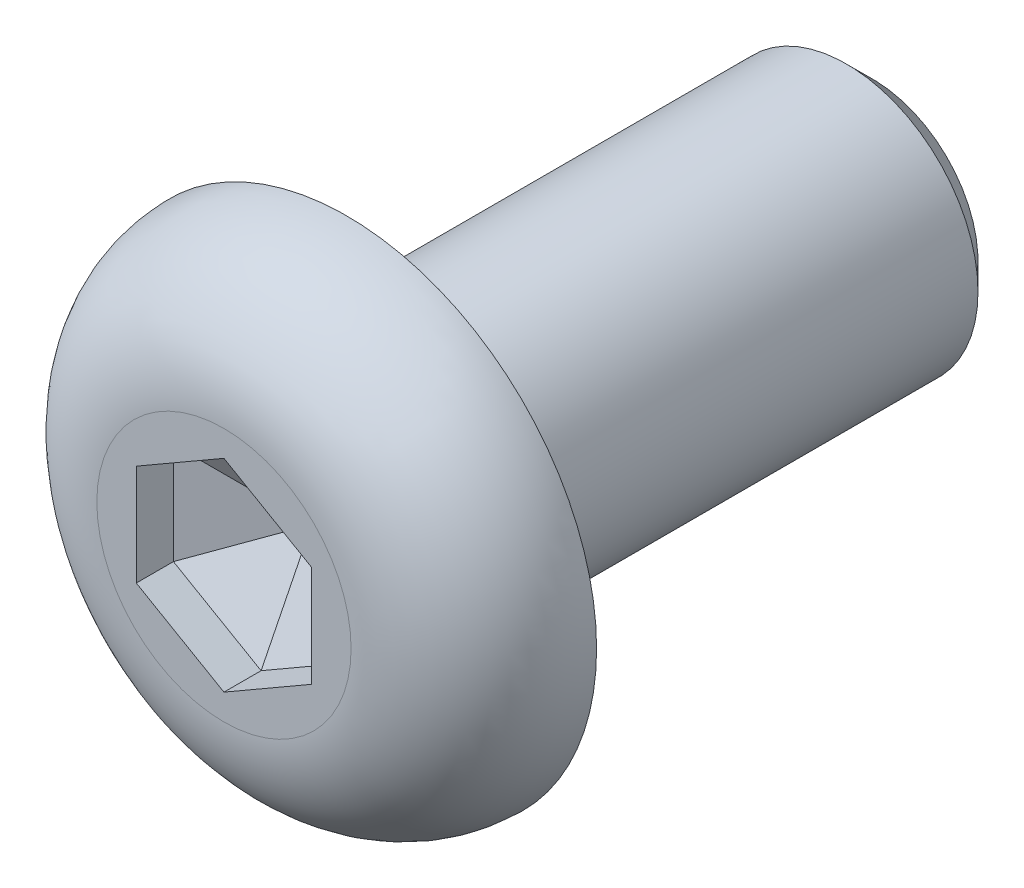
ISO-10303-21;
HEADER;
FILE_DESCRIPTION(('STEP AP214'),'2;1');
FILE_NAME('part.step','',(''),(''),'','','');
FILE_SCHEMA(('AUTOMOTIVE_DESIGN { 1 0 10303 214 1 1 1 1 }'));
ENDSEC;
DATA;
#1=APPLICATION_CONTEXT('core data for automotive mechanical design processes');
#2=APPLICATION_PROTOCOL_DEFINITION('international standard','automotive_design',2000,#1);
#3=PRODUCT_CONTEXT('',#1,'mechanical');
#4=PRODUCT('Part','Part','',(#3));
#5=PRODUCT_RELATED_PRODUCT_CATEGORY('part','',(#4));
#6=PRODUCT_DEFINITION_FORMATION('','',#4);
#7=PRODUCT_DEFINITION_CONTEXT('part definition',#1,'design');
#8=PRODUCT_DEFINITION('design','',#6,#7);
#9=PRODUCT_DEFINITION_SHAPE('','',#8);
#10=(LENGTH_UNIT() NAMED_UNIT(*) SI_UNIT(.MILLI.,.METRE.));
#11=(NAMED_UNIT(*) PLANE_ANGLE_UNIT() SI_UNIT($,.RADIAN.));
#12=(NAMED_UNIT(*) SI_UNIT($,.STERADIAN.) SOLID_ANGLE_UNIT());
#13=UNCERTAINTY_MEASURE_WITH_UNIT(LENGTH_MEASURE(1.E-05),#10,'distance_accuracy_value','');
#14=(GEOMETRIC_REPRESENTATION_CONTEXT(3) GLOBAL_UNCERTAINTY_ASSIGNED_CONTEXT((#13)) GLOBAL_UNIT_ASSIGNED_CONTEXT((#10,
#11,#12)) REPRESENTATION_CONTEXT('',''));
#15=CARTESIAN_POINT('',(0.,0.,0.));
#16=DIRECTION('',(0.,0.,1.));
#17=DIRECTION('',(1.,0.,0.));
#18=AXIS2_PLACEMENT_3D('',#15,#16,#17);
#19=CARTESIAN_POINT('',(0.,0.,0.));
#20=DIRECTION('',(0.,0.,1.));
#21=DIRECTION('',(1.,0.,0.));
#22=AXIS2_PLACEMENT_3D('',#19,#20,#21);
#23=PLANE('',#22);
#24=CARTESIAN_POINT('',(0.,0.,0.));
#25=DIRECTION('',(0.,0.,1.));
#26=DIRECTION('',(1.,0.,0.));
#27=AXIS2_PLACEMENT_3D('',#24,#25,#26);
#28=CIRCLE('',#27,1.6);
#29=CARTESIAN_POINT('',(1.6,0.,0.));
#30=VERTEX_POINT('',#29);
#31=EDGE_CURVE('E11',#30,#30,#28,.T.);
#32=ORIENTED_EDGE('',*,*,#31,.T.);
#33=EDGE_LOOP('',(#32));
#34=FACE_BOUND('',#33,.T.);
#35=CARTESIAN_POINT('',(0.,0.,0.));
#36=DIRECTION('',(0.,0.,1.));
#37=DIRECTION('',(1.,0.,0.));
#38=AXIS2_PLACEMENT_3D('',#35,#36,#37);
#39=CIRCLE('',#38,2.85);
#40=CARTESIAN_POINT('',(2.85,0.,0.));
#41=VERTEX_POINT('',#40);
#42=EDGE_CURVE('E150',#41,#41,#39,.T.);
#43=ORIENTED_EDGE('',*,*,#42,.F.);
#44=EDGE_LOOP('',(#43));
#45=FACE_BOUND('',#44,.T.);
#46=ADVANCED_FACE('F42',(#34,#45),#23,.F.);
#47=CARTESIAN_POINT('',(0.,0.,1.4));
#48=DIRECTION('',(0.,0.,1.));
#49=DIRECTION('',(1.,0.,0.));
#50=AXIS2_PLACEMENT_3D('',#47,#48,#49);
#51=PLANE('',#50);
#52=DIRECTION('',(0.,1.,0.));
#53=VECTOR('',#52,1.);
#54=CARTESIAN_POINT('',(1.,-0.577350269189626,1.4));
#55=LINE('',#54,#53);
#56=CARTESIAN_POINT('',(1.,-0.577350269189626,1.4));
#57=VERTEX_POINT('',#56);
#58=CARTESIAN_POINT('',(1.,0.577350269189626,1.4));
#59=VERTEX_POINT('',#58);
#60=EDGE_CURVE('E131',#57,#59,#55,.T.);
#61=ORIENTED_EDGE('',*,*,#60,.F.);
#62=DIRECTION('',(0.866025403784439,0.5,0.));
#63=VECTOR('',#62,1.);
#64=CARTESIAN_POINT('',(0.,-1.15470053837925,1.4));
#65=LINE('',#64,#63);
#66=CARTESIAN_POINT('',(0.,-1.15470053837925,1.4));
#67=VERTEX_POINT('',#66);
#68=EDGE_CURVE('E145',#67,#57,#65,.T.);
#69=ORIENTED_EDGE('',*,*,#68,.F.);
#70=DIRECTION('',(0.866025403784439,-0.5,0.));
#71=VECTOR('',#70,1.);
#72=CARTESIAN_POINT('',(-1.,-0.577350269189626,1.4));
#73=LINE('',#72,#71);
#74=CARTESIAN_POINT('',(-1.,-0.577350269189626,1.4));
#75=VERTEX_POINT('',#74);
#76=EDGE_CURVE('E139',#75,#67,#73,.T.);
#77=ORIENTED_EDGE('',*,*,#76,.F.);
#78=DIRECTION('',(0.,-1.,0.));
#79=VECTOR('',#78,1.);
#80=CARTESIAN_POINT('',(-1.,0.577350269189626,1.4));
#81=LINE('',#80,#79);
#82=CARTESIAN_POINT('',(-1.,0.577350269189626,1.4));
#83=VERTEX_POINT('',#82);
#84=EDGE_CURVE('E137',#83,#75,#81,.T.);
#85=ORIENTED_EDGE('',*,*,#84,.F.);
#86=DIRECTION('',(-0.866025403784439,-0.5,0.));
#87=VECTOR('',#86,1.);
#88=CARTESIAN_POINT('',(0.,1.15470053837925,1.4));
#89=LINE('',#88,#87);
#90=CARTESIAN_POINT('',(0.,1.15470053837925,1.4));
#91=VERTEX_POINT('',#90);
#92=EDGE_CURVE('E118',#91,#83,#89,.T.);
#93=ORIENTED_EDGE('',*,*,#92,.F.);
#94=DIRECTION('',(-0.866025403784439,0.5,0.));
#95=VECTOR('',#94,1.);
#96=CARTESIAN_POINT('',(1.,0.577350269189626,1.4));
#97=LINE('',#96,#95);
#98=EDGE_CURVE('E126',#59,#91,#97,.T.);
#99=ORIENTED_EDGE('',*,*,#98,.F.);
#100=EDGE_LOOP('',(#61,#69,#77,#85,#93,#99));
#101=FACE_BOUND('',#100,.T.);
#102=CARTESIAN_POINT('',(0.,0.,1.4));
#103=DIRECTION('',(0.,0.,1.));
#104=DIRECTION('',(1.,0.,0.));
#105=AXIS2_PLACEMENT_3D('',#102,#103,#104);
#106=CIRCLE('',#105,1.45);
#107=CARTESIAN_POINT('',(1.45,0.,1.4));
#108=VERTEX_POINT('',#107);
#109=EDGE_CURVE('E159',#108,#108,#106,.T.);
#110=ORIENTED_EDGE('',*,*,#109,.T.);
#111=EDGE_LOOP('',(#110));
#112=FACE_BOUND('',#111,.T.);
#113=ADVANCED_FACE('F133',(#101,#112),#51,.T.);
#114=CARTESIAN_POINT('',(0.,0.,0.));
#115=DIRECTION('',(0.,0.,1.));
#116=DIRECTION('',(1.,0.,0.));
#117=AXIS2_PLACEMENT_3D('',#114,#115,#116);
#118=TOROIDAL_SURFACE('',#117,1.45,1.4);
#119=ORIENTED_EDGE('',*,*,#42,.T.);
#120=EDGE_LOOP('',(#119));
#121=FACE_BOUND('',#120,.T.);
#122=ORIENTED_EDGE('',*,*,#109,.F.);
#123=EDGE_LOOP('',(#122));
#124=FACE_BOUND('',#123,.T.);
#125=ADVANCED_FACE('F228',(#121,#124),#118,.T.);
#126=CARTESIAN_POINT('',(0.,0.,-6.));
#127=DIRECTION('',(0.,0.,1.));
#128=DIRECTION('',(1.,0.,0.));
#129=AXIS2_PLACEMENT_3D('',#126,#127,#128);
#130=CYLINDRICAL_SURFACE('',#129,1.5);
#131=CARTESIAN_POINT('',(0.,0.,-0.1));
#132=DIRECTION('',(0.,0.,1.));
#133=DIRECTION('',(1.,0.,0.));
#134=AXIS2_PLACEMENT_3D('',#131,#132,#133);
#135=CIRCLE('',#134,1.5);
#136=CARTESIAN_POINT('',(1.5,0.,-0.1));
#137=VERTEX_POINT('',#136);
#138=EDGE_CURVE('E50',#137,#137,#135,.F.);
#139=ORIENTED_EDGE('',*,*,#138,.T.);
#140=EDGE_LOOP('',(#139));
#141=FACE_BOUND('',#140,.T.);
#142=CARTESIAN_POINT('',(0.,0.,-5.7));
#143=DIRECTION('',(0.,0.,-1.));
#144=DIRECTION('',(-1.,0.,0.));
#145=AXIS2_PLACEMENT_3D('',#142,#143,#144);
#146=CIRCLE('',#145,1.5);
#147=CARTESIAN_POINT('',(-1.5,0.,-5.7));
#148=VERTEX_POINT('',#147);
#149=EDGE_CURVE('E165',#148,#148,#146,.F.);
#150=ORIENTED_EDGE('',*,*,#149,.T.);
#151=EDGE_LOOP('',(#150));
#152=FACE_BOUND('',#151,.T.);
#153=ADVANCED_FACE('F209',(#141,#152),#130,.T.);
#154=CARTESIAN_POINT('',(0.,0.,-6.));
#155=DIRECTION('',(0.,0.,-1.));
#156=DIRECTION('',(-1.,0.,0.));
#157=AXIS2_PLACEMENT_3D('',#154,#155,#156);
#158=PLANE('',#157);
#159=CARTESIAN_POINT('',(0.,0.,-6.));
#160=DIRECTION('',(0.,0.,-1.));
#161=DIRECTION('',(-1.,0.,0.));
#162=AXIS2_PLACEMENT_3D('',#159,#160,#161);
#163=CIRCLE('',#162,1.2);
#164=CARTESIAN_POINT('',(-1.2,0.,-6.));
#165=VERTEX_POINT('',#164);
#166=EDGE_CURVE('E162',#165,#165,#163,.T.);
#167=ORIENTED_EDGE('',*,*,#166,.T.);
#168=EDGE_LOOP('',(#167));
#169=FACE_BOUND('',#168,.T.);
#170=ADVANCED_FACE('F303',(#169),#158,.T.);
#171=CARTESIAN_POINT('',(1.,-0.577350269189626,0.4));
#172=DIRECTION('',(1.,0.,0.));
#173=DIRECTION('',(0.,0.,-1.));
#174=AXIS2_PLACEMENT_3D('',#171,#172,#173);
#175=PLANE('',#174);
#176=DIRECTION('',(0.,0.,1.));
#177=VECTOR('',#176,1.);
#178=CARTESIAN_POINT('',(1.,0.577350269189626,0.4));
#179=LINE('',#178,#177);
#180=CARTESIAN_POINT('',(1.,0.577350269189626,0.97636887608069));
#181=VERTEX_POINT('',#180);
#182=EDGE_CURVE('E123',#181,#59,#179,.T.);
#183=ORIENTED_EDGE('',*,*,#182,.F.);
#184=DIRECTION('',(0.,-1.,0.));
#185=VECTOR('',#184,1.);
#186=CARTESIAN_POINT('',(1.,-0.577350269189626,0.97636887608069));
#187=LINE('',#186,#185);
#188=CARTESIAN_POINT('',(1.,-0.577350269189626,0.97636887608069));
#189=VERTEX_POINT('',#188);
#190=EDGE_CURVE('E57',#181,#189,#187,.T.);
#191=ORIENTED_EDGE('',*,*,#190,.T.);
#192=DIRECTION('',(0.,0.,1.));
#193=VECTOR('',#192,1.);
#194=CARTESIAN_POINT('',(1.,-0.577350269189626,0.4));
#195=LINE('',#194,#193);
#196=EDGE_CURVE('E148',#189,#57,#195,.T.);
#197=ORIENTED_EDGE('',*,*,#196,.T.);
#198=ORIENTED_EDGE('',*,*,#60,.T.);
#199=EDGE_LOOP('',(#183,#191,#197,#198));
#200=FACE_BOUND('',#199,.T.);
#201=ADVANCED_FACE('F294',(#200),#175,.F.);
#202=CARTESIAN_POINT('',(0.,-1.15470053837925,0.4));
#203=DIRECTION('',(0.5,-0.866025403784439,0.));
#204=DIRECTION('',(0.866025403784439,0.5,0.));
#205=AXIS2_PLACEMENT_3D('',#202,#203,#204);
#206=PLANE('',#205);
#207=ORIENTED_EDGE('',*,*,#196,.F.);
#208=DIRECTION('',(-0.866025403784439,-0.5,0.));
#209=VECTOR('',#208,1.);
#210=CARTESIAN_POINT('',(0.,-1.15470053837925,0.976368876080689));
#211=LINE('',#210,#209);
#212=CARTESIAN_POINT('',(0.,-1.15470053837925,0.976368876080689));
#213=VERTEX_POINT('',#212);
#214=EDGE_CURVE('E188',#189,#213,#211,.T.);
#215=ORIENTED_EDGE('',*,*,#214,.T.);
#216=DIRECTION('',(0.,0.,1.));
#217=VECTOR('',#216,1.);
#218=CARTESIAN_POINT('',(0.,-1.15470053837925,0.4));
#219=LINE('',#218,#217);
#220=EDGE_CURVE('E151',#213,#67,#219,.T.);
#221=ORIENTED_EDGE('',*,*,#220,.T.);
#222=ORIENTED_EDGE('',*,*,#68,.T.);
#223=EDGE_LOOP('',(#207,#215,#221,#222));
#224=FACE_BOUND('',#223,.T.);
#225=ADVANCED_FACE('F270',(#224),#206,.F.);
#226=CARTESIAN_POINT('',(-1.,-0.577350269189626,0.4));
#227=DIRECTION('',(-0.5,-0.866025403784438,0.));
#228=DIRECTION('',(0.866025403784439,-0.5,0.));
#229=AXIS2_PLACEMENT_3D('',#226,#227,#228);
#230=PLANE('',#229);
#231=ORIENTED_EDGE('',*,*,#220,.F.);
#232=DIRECTION('',(-0.866025403784439,0.5,0.));
#233=VECTOR('',#232,1.);
#234=CARTESIAN_POINT('',(-1.,-0.577350269189626,0.97636887608069));
#235=LINE('',#234,#233);
#236=CARTESIAN_POINT('',(-1.,-0.577350269189626,0.97636887608069));
#237=VERTEX_POINT('',#236);
#238=EDGE_CURVE('E181',#213,#237,#235,.T.);
#239=ORIENTED_EDGE('',*,*,#238,.T.);
#240=DIRECTION('',(0.,0.,1.));
#241=VECTOR('',#240,1.);
#242=CARTESIAN_POINT('',(-1.,-0.577350269189626,0.4));
#243=LINE('',#242,#241);
#244=EDGE_CURVE('E153',#237,#75,#243,.T.);
#245=ORIENTED_EDGE('',*,*,#244,.T.);
#246=ORIENTED_EDGE('',*,*,#76,.T.);
#247=EDGE_LOOP('',(#231,#239,#245,#246));
#248=FACE_BOUND('',#247,.T.);
#249=ADVANCED_FACE('F273',(#248),#230,.F.);
#250=CARTESIAN_POINT('',(-1.,0.577350269189626,0.4));
#251=DIRECTION('',(-1.,0.,0.));
#252=DIRECTION('',(0.,0.,1.));
#253=AXIS2_PLACEMENT_3D('',#250,#251,#252);
#254=PLANE('',#253);
#255=ORIENTED_EDGE('',*,*,#244,.F.);
#256=DIRECTION('',(0.,1.,0.));
#257=VECTOR('',#256,1.);
#258=CARTESIAN_POINT('',(-1.,0.577350269189626,0.97636887608069));
#259=LINE('',#258,#257);
#260=CARTESIAN_POINT('',(-1.,0.577350269189626,0.976368876080689));
#261=VERTEX_POINT('',#260);
#262=EDGE_CURVE('E184',#237,#261,#259,.T.);
#263=ORIENTED_EDGE('',*,*,#262,.T.);
#264=DIRECTION('',(0.,0.,1.));
#265=VECTOR('',#264,1.);
#266=CARTESIAN_POINT('',(-1.,0.577350269189626,0.4));
#267=LINE('',#266,#265);
#268=EDGE_CURVE('E122',#261,#83,#267,.T.);
#269=ORIENTED_EDGE('',*,*,#268,.T.);
#270=ORIENTED_EDGE('',*,*,#84,.T.);
#271=EDGE_LOOP('',(#255,#263,#269,#270));
#272=FACE_BOUND('',#271,.T.);
#273=ADVANCED_FACE('F282',(#272),#254,.F.);
#274=CARTESIAN_POINT('',(0.,1.15470053837925,0.4));
#275=DIRECTION('',(-0.5,0.866025403784439,0.));
#276=DIRECTION('',(-0.866025403784439,-0.5,0.));
#277=AXIS2_PLACEMENT_3D('',#274,#275,#276);
#278=PLANE('',#277);
#279=ORIENTED_EDGE('',*,*,#268,.F.);
#280=DIRECTION('',(0.866025403784439,0.5,0.));
#281=VECTOR('',#280,1.);
#282=CARTESIAN_POINT('',(0.,1.15470053837925,0.976368876080689));
#283=LINE('',#282,#281);
#284=CARTESIAN_POINT('',(0.,1.15470053837925,0.97636887608069));
#285=VERTEX_POINT('',#284);
#286=EDGE_CURVE('E121',#261,#285,#283,.T.);
#287=ORIENTED_EDGE('',*,*,#286,.T.);
#288=DIRECTION('',(0.,0.,1.));
#289=VECTOR('',#288,1.);
#290=CARTESIAN_POINT('',(0.,1.15470053837925,0.4));
#291=LINE('',#290,#289);
#292=EDGE_CURVE('E113',#285,#91,#291,.T.);
#293=ORIENTED_EDGE('',*,*,#292,.T.);
#294=ORIENTED_EDGE('',*,*,#92,.T.);
#295=EDGE_LOOP('',(#279,#287,#293,#294));
#296=FACE_BOUND('',#295,.T.);
#297=ADVANCED_FACE('F116',(#296),#278,.F.);
#298=CARTESIAN_POINT('',(1.,0.577350269189626,0.4));
#299=DIRECTION('',(0.5,0.866025403784439,0.));
#300=DIRECTION('',(-0.866025403784439,0.5,0.));
#301=AXIS2_PLACEMENT_3D('',#298,#299,#300);
#302=PLANE('',#301);
#303=ORIENTED_EDGE('',*,*,#292,.F.);
#304=DIRECTION('',(0.866025403784439,-0.5,0.));
#305=VECTOR('',#304,1.);
#306=CARTESIAN_POINT('',(1.,0.577350269189626,0.97636887608069));
#307=LINE('',#306,#305);
#308=EDGE_CURVE('E65',#285,#181,#307,.T.);
#309=ORIENTED_EDGE('',*,*,#308,.T.);
#310=ORIENTED_EDGE('',*,*,#182,.T.);
#311=ORIENTED_EDGE('',*,*,#98,.T.);
#312=EDGE_LOOP('',(#303,#309,#310,#311));
#313=FACE_BOUND('',#312,.T.);
#314=ADVANCED_FACE('F127',(#313),#302,.F.);
#315=CARTESIAN_POINT('',(0.,0.,0.4));
#316=DIRECTION('',(0.,0.,1.));
#317=DIRECTION('',(1.,0.,0.));
#318=AXIS2_PLACEMENT_3D('',#315,#316,#317);
#319=PLANE('',#318);
#320=DIRECTION('',(0.,-1.,0.));
#321=VECTOR('',#320,1.);
#322=CARTESIAN_POINT('',(-0.00169982272686209,0.,0.4));
#323=LINE('',#322,#321);
#324=CARTESIAN_POINT('',(-0.00169982272686209,0.000981393108929282,0.4));
#325=VERTEX_POINT('',#324);
#326=CARTESIAN_POINT('',(-0.00169982272686209,-0.000981393108928711,0.4));
#327=VERTEX_POINT('',#326);
#328=EDGE_CURVE('E176',#325,#327,#323,.T.);
#329=ORIENTED_EDGE('',*,*,#328,.T.);
#330=DIRECTION('',(0.866025403784439,-0.5,0.));
#331=VECTOR('',#330,1.);
#332=CARTESIAN_POINT('',(-0.000849911363431152,-0.00147208966339289,0.4));
#333=LINE('',#332,#331);
#334=CARTESIAN_POINT('',(0.,-0.00196278621785737,0.4));
#335=VERTEX_POINT('',#334);
#336=EDGE_CURVE('E178',#327,#335,#333,.T.);
#337=ORIENTED_EDGE('',*,*,#336,.T.);
#338=DIRECTION('',(0.866025403784439,0.5,0.));
#339=VECTOR('',#338,1.);
#340=CARTESIAN_POINT('',(0.000849911363431287,-0.00147208966339313,0.4));
#341=LINE('',#340,#339);
#342=CARTESIAN_POINT('',(0.0016998227268623,-0.000981393108928877,0.4));
#343=VERTEX_POINT('',#342);
#344=EDGE_CURVE('E170',#335,#343,#341,.T.);
#345=ORIENTED_EDGE('',*,*,#344,.T.);
#346=DIRECTION('',(0.,1.,0.));
#347=VECTOR('',#346,1.);
#348=CARTESIAN_POINT('',(0.0016998227268623,0.,0.4));
#349=LINE('',#348,#347);
#350=CARTESIAN_POINT('',(0.0016998227268623,0.000981393108928661,0.4));
#351=VERTEX_POINT('',#350);
#352=EDGE_CURVE('E168',#343,#351,#349,.T.);
#353=ORIENTED_EDGE('',*,*,#352,.T.);
#354=DIRECTION('',(-0.866025403784439,0.5,0.));
#355=VECTOR('',#354,1.);
#356=CARTESIAN_POINT('',(0.000849911363431178,0.00147208966339294,0.4));
#357=LINE('',#356,#355);
#358=CARTESIAN_POINT('',(0.,0.00196278621785748,0.4));
#359=VERTEX_POINT('',#358);
#360=EDGE_CURVE('E172',#351,#359,#357,.T.);
#361=ORIENTED_EDGE('',*,*,#360,.T.);
#362=DIRECTION('',(-0.866025403784439,-0.5,0.));
#363=VECTOR('',#362,1.);
#364=CARTESIAN_POINT('',(-0.000849911363431395,0.00147208966339331,0.4));
#365=LINE('',#364,#363);
#366=EDGE_CURVE('E174',#359,#325,#365,.T.);
#367=ORIENTED_EDGE('',*,*,#366,.T.);
#368=EDGE_LOOP('',(#329,#337,#345,#353,#361,#367));
#369=FACE_BOUND('',#368,.T.);
#370=ADVANCED_FACE('F239',(#369),#319,.T.);
#371=CARTESIAN_POINT('',(0.,0.,-6.));
#372=DIRECTION('',(0.,0.,1.));
#373=DIRECTION('',(1.,0.,0.));
#374=AXIS2_PLACEMENT_3D('',#371,#372,#373);
#375=CONICAL_SURFACE('',#374,1.2,0.785398163397448);
#376=ORIENTED_EDGE('',*,*,#149,.F.);
#377=EDGE_LOOP('',(#376));
#378=FACE_BOUND('',#377,.T.);
#379=ORIENTED_EDGE('',*,*,#166,.F.);
#380=EDGE_LOOP('',(#379));
#381=FACE_BOUND('',#380,.T.);
#382=ADVANCED_FACE('F236',(#378,#381),#375,.T.);
#383=CARTESIAN_POINT('',(0.000849911363431151,0.00147208966339289,0.4));
#384=DIRECTION('',(0.249999999999998,0.433012701892215,-0.866025403784441));
#385=DIRECTION('',(-0.866025403784439,0.5,0.));
#386=AXIS2_PLACEMENT_3D('',#383,#384,#385);
#387=PLANE('',#386);
#388=DIRECTION('',(-0.774596669241485,-0.447213595499959,-0.447213595499953));
#389=VECTOR('',#388,1.);
#390=CARTESIAN_POINT('',(0.00135985818148984,0.000785114487142874,0.399803721378214));
#391=LINE('',#390,#389);
#392=EDGE_CURVE('E201',#181,#351,#391,.T.);
#393=ORIENTED_EDGE('',*,*,#392,.F.);
#394=ORIENTED_EDGE('',*,*,#308,.F.);
#395=DIRECTION('',(0.,-0.894427190999918,-0.447213595499953));
#396=VECTOR('',#395,1.);
#397=CARTESIAN_POINT('',(0.,0.00157022897428614,0.399803721378214));
#398=LINE('',#397,#396);
#399=EDGE_CURVE('E204',#359,#285,#398,.F.);
#400=ORIENTED_EDGE('',*,*,#399,.F.);
#401=ORIENTED_EDGE('',*,*,#360,.F.);
#402=EDGE_LOOP('',(#393,#394,#400,#401));
#403=FACE_BOUND('',#402,.T.);
#404=ADVANCED_FACE('F238',(#403),#387,.F.);
#405=CARTESIAN_POINT('',(-0.000849911363431395,0.00147208966339331,0.4));
#406=DIRECTION('',(-0.249999999999997,0.433012701892215,-0.866025403784441));
#407=DIRECTION('',(-0.866025403784439,-0.5,0.));
#408=AXIS2_PLACEMENT_3D('',#405,#406,#407);
#409=PLANE('',#408);
#410=ORIENTED_EDGE('',*,*,#399,.T.);
#411=ORIENTED_EDGE('',*,*,#286,.F.);
#412=DIRECTION('',(0.774596669241485,-0.447213595499959,-0.447213595499953));
#413=VECTOR('',#412,1.);
#414=CARTESIAN_POINT('',(-0.00135985818148939,0.000785114487143425,0.399803721378214));
#415=LINE('',#414,#413);
#416=EDGE_CURVE('E198',#325,#261,#415,.F.);
#417=ORIENTED_EDGE('',*,*,#416,.F.);
#418=ORIENTED_EDGE('',*,*,#366,.F.);
#419=EDGE_LOOP('',(#410,#411,#417,#418));
#420=FACE_BOUND('',#419,.T.);
#421=ADVANCED_FACE('F252',(#420),#409,.F.);
#422=CARTESIAN_POINT('',(0.0016998227268623,0.,0.4));
#423=DIRECTION('',(0.499999999999995,0.,-0.866025403784441));
#424=DIRECTION('',(0.,1.,0.));
#425=AXIS2_PLACEMENT_3D('',#422,#423,#424);
#426=PLANE('',#425);
#427=ORIENTED_EDGE('',*,*,#392,.T.);
#428=ORIENTED_EDGE('',*,*,#352,.F.);
#429=DIRECTION('',(0.774596669241485,-0.447213595499959,0.447213595499953));
#430=VECTOR('',#429,1.);
#431=CARTESIAN_POINT('',(0.00135985818148989,-0.000785114487143219,0.399803721378214));
#432=LINE('',#431,#430);
#433=EDGE_CURVE('E195',#189,#343,#432,.F.);
#434=ORIENTED_EDGE('',*,*,#433,.F.);
#435=ORIENTED_EDGE('',*,*,#190,.F.);
#436=EDGE_LOOP('',(#427,#428,#434,#435));
#437=FACE_BOUND('',#436,.T.);
#438=ADVANCED_FACE('F248',(#437),#426,.F.);
#439=CARTESIAN_POINT('',(-0.00169982272686209,0.,0.4));
#440=DIRECTION('',(-0.499999999999995,0.,-0.866025403784441));
#441=DIRECTION('',(0.,-1.,0.));
#442=AXIS2_PLACEMENT_3D('',#439,#440,#441);
#443=PLANE('',#442);
#444=ORIENTED_EDGE('',*,*,#416,.T.);
#445=ORIENTED_EDGE('',*,*,#262,.F.);
#446=DIRECTION('',(0.774596669241486,0.447213595499959,-0.447213595499953));
#447=VECTOR('',#446,1.);
#448=CARTESIAN_POINT('',(-0.00135985818148971,-0.00078511448714305,0.399803721378214));
#449=LINE('',#448,#447);
#450=EDGE_CURVE('E193',#327,#237,#449,.F.);
#451=ORIENTED_EDGE('',*,*,#450,.F.);
#452=ORIENTED_EDGE('',*,*,#328,.F.);
#453=EDGE_LOOP('',(#444,#445,#451,#452));
#454=FACE_BOUND('',#453,.T.);
#455=ADVANCED_FACE('F244',(#454),#443,.F.);
#456=CARTESIAN_POINT('',(0.000849911363431287,-0.00147208966339313,0.4));
#457=DIRECTION('',(0.249999999999998,-0.433012701892215,-0.866025403784441));
#458=DIRECTION('',(0.866025403784439,0.5,0.));
#459=AXIS2_PLACEMENT_3D('',#456,#457,#458);
#460=PLANE('',#459);
#461=ORIENTED_EDGE('',*,*,#433,.T.);
#462=ORIENTED_EDGE('',*,*,#344,.F.);
#463=DIRECTION('',(0.,-0.894427190999918,0.447213595499953));
#464=VECTOR('',#463,1.);
#465=CARTESIAN_POINT('',(0.,-0.00157022897428578,0.399803721378214));
#466=LINE('',#465,#464);
#467=EDGE_CURVE('E191',#213,#335,#466,.F.);
#468=ORIENTED_EDGE('',*,*,#467,.F.);
#469=ORIENTED_EDGE('',*,*,#214,.F.);
#470=EDGE_LOOP('',(#461,#462,#468,#469));
#471=FACE_BOUND('',#470,.T.);
#472=ADVANCED_FACE('F218',(#471),#460,.F.);
#473=CARTESIAN_POINT('',(-0.000849911363431152,-0.00147208966339289,0.4));
#474=DIRECTION('',(-0.249999999999998,-0.433012701892215,-0.866025403784441));
#475=DIRECTION('',(0.866025403784439,-0.5,0.));
#476=AXIS2_PLACEMENT_3D('',#473,#474,#475);
#477=PLANE('',#476);
#478=ORIENTED_EDGE('',*,*,#450,.T.);
#479=ORIENTED_EDGE('',*,*,#238,.F.);
#480=ORIENTED_EDGE('',*,*,#467,.T.);
#481=ORIENTED_EDGE('',*,*,#336,.F.);
#482=EDGE_LOOP('',(#478,#479,#480,#481));
#483=FACE_BOUND('',#482,.T.);
#484=ADVANCED_FACE('F213',(#483),#477,.F.);
#485=CARTESIAN_POINT('',(0.,0.,-0.1));
#486=DIRECTION('',(0.,0.,1.));
#487=DIRECTION('',(1.,0.,0.));
#488=AXIS2_PLACEMENT_3D('',#485,#486,#487);
#489=TOROIDAL_SURFACE('',#488,1.6,0.1);
#490=ORIENTED_EDGE('',*,*,#31,.F.);
#491=EDGE_LOOP('',(#490));
#492=FACE_BOUND('',#491,.T.);
#493=ORIENTED_EDGE('',*,*,#138,.F.);
#494=EDGE_LOOP('',(#493));
#495=FACE_BOUND('',#494,.T.);
#496=ADVANCED_FACE('F44',(#492,#495),#489,.F.);
#497=CLOSED_SHELL('',(#46,#113,#125,#153,#170,#201,#225,#249,#273,#297,#314,#370,#382,#404,#421,
#438,#455,#472,#484,#496));
#498=MANIFOLD_SOLID_BREP('B2',#497);
#499=ADVANCED_BREP_SHAPE_REPRESENTATION('',(#18,#498),#14);
#500=SHAPE_DEFINITION_REPRESENTATION(#9,#499);
ENDSEC;
END-ISO-10303-21;
